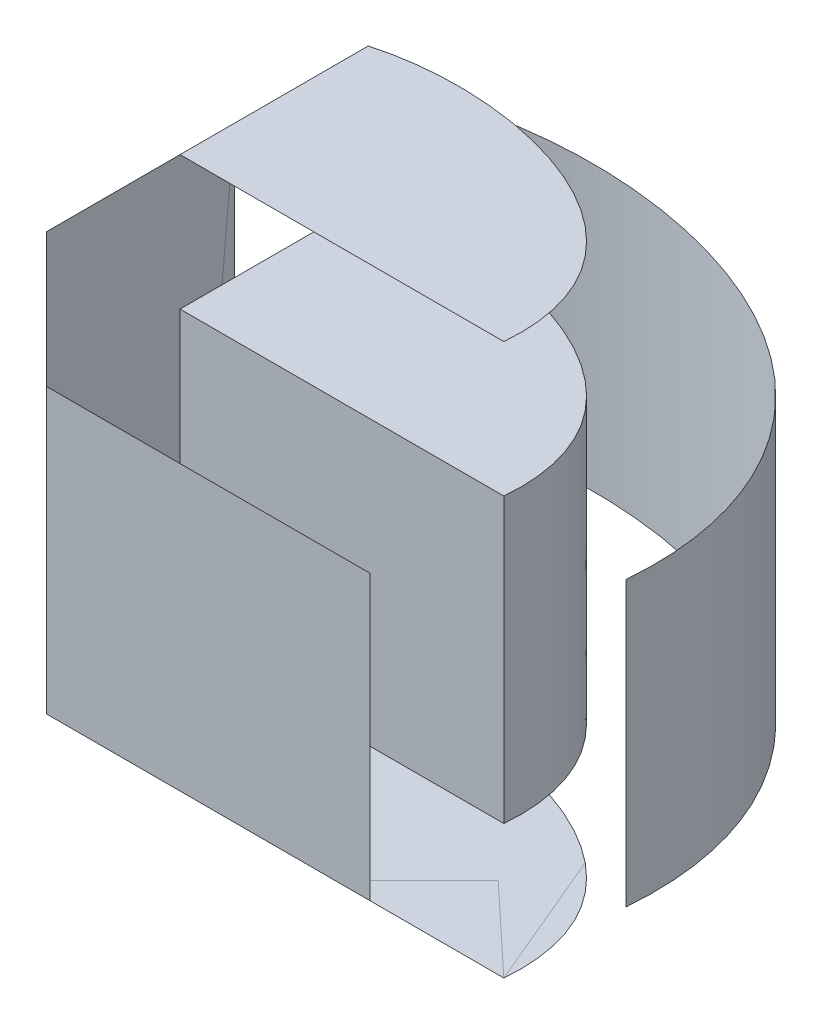
ISO-10303-21;
HEADER;
FILE_DESCRIPTION(('STEP AP214'),'2;1');
FILE_NAME('part.step','',(''),(''),'','','');
FILE_SCHEMA(('AUTOMOTIVE_DESIGN { 1 0 10303 214 1 1 1 1 }'));
ENDSEC;
DATA;
#1=APPLICATION_CONTEXT('core data for automotive mechanical design processes');
#2=APPLICATION_PROTOCOL_DEFINITION('international standard','automotive_design',2000,#1);
#3=PRODUCT_CONTEXT('',#1,'mechanical');
#4=PRODUCT('Part','Part','',(#3));
#5=PRODUCT_RELATED_PRODUCT_CATEGORY('part','',(#4));
#6=PRODUCT_DEFINITION_FORMATION('','',#4);
#7=PRODUCT_DEFINITION_CONTEXT('part definition',#1,'design');
#8=PRODUCT_DEFINITION('design','',#6,#7);
#9=PRODUCT_DEFINITION_SHAPE('','',#8);
#10=(LENGTH_UNIT() NAMED_UNIT(*) SI_UNIT(.MILLI.,.METRE.));
#11=(NAMED_UNIT(*) PLANE_ANGLE_UNIT() SI_UNIT($,.RADIAN.));
#12=(NAMED_UNIT(*) SI_UNIT($,.STERADIAN.) SOLID_ANGLE_UNIT());
#13=UNCERTAINTY_MEASURE_WITH_UNIT(LENGTH_MEASURE(1.E-05),#10,'distance_accuracy_value','');
#14=(GEOMETRIC_REPRESENTATION_CONTEXT(3) GLOBAL_UNCERTAINTY_ASSIGNED_CONTEXT((#13)) GLOBAL_UNIT_ASSIGNED_CONTEXT((#10,
#11,#12)) REPRESENTATION_CONTEXT('',''));
#15=CARTESIAN_POINT('',(0.,0.,0.));
#16=DIRECTION('',(0.,0.,1.));
#17=DIRECTION('',(1.,0.,0.));
#18=AXIS2_PLACEMENT_3D('',#15,#16,#17);
#19=CARTESIAN_POINT('',(18.6420812578485,-103.,-25.6244637121298));
#20=DIRECTION('',(0.,1.,0.));
#21=DIRECTION('',(0.,0.,1.));
#22=AXIS2_PLACEMENT_3D('',#19,#20,#21);
#23=PLANE('',#22);
#24=CARTESIAN_POINT('',(59.7318013736338,-103.,38.4270232031692));
#25=CARTESIAN_POINT('',(65.1709209471579,-103.,-25.3085093729767));
#26=CARTESIAN_POINT('',(-14.935887617342,-103.,-45.201796535286));
#27=CARTESIAN_POINT('',(-61.3002513002938,-103.,-31.8918151754193));
#28=CARTESIAN_POINT('',(-78.2377452730158,-103.,-27.0295090602881));
#29=CARTESIAN_POINT('',(-95.1752392457378,-103.,-22.1672029451569));
#30=CARTESIAN_POINT('',(-112.11273321846,-103.,-17.3048968300257));
#31=B_SPLINE_CURVE_WITH_KNOTS('',3,(#24,#25,#26,#27,#28,#29,#30),.UNSPECIFIED.,.F.,.F.,(4,3,4),
(0.,1.,1.36531276668744),.UNSPECIFIED.);
#32=CARTESIAN_POINT('',(59.7318013736338,-103.,38.4270232031692));
#33=VERTEX_POINT('',#32);
#34=CARTESIAN_POINT('',(-111.300251300294,-103.,-17.5381388790263));
#35=VERTEX_POINT('',#34);
#36=EDGE_CURVE('E75',#33,#35,#31,.T.);
#37=ORIENTED_EDGE('',*,*,#36,.F.);
#38=DIRECTION('',(1.,0.,0.));
#39=VECTOR('',#38,1.);
#40=CARTESIAN_POINT('',(18.6420812578485,-103.,38.4270232031692));
#41=LINE('',#40,#39);
#42=CARTESIAN_POINT('',(-111.300251300294,-103.,38.4270232031692));
#43=VERTEX_POINT('',#42);
#44=EDGE_CURVE('E61',#43,#33,#41,.T.);
#45=ORIENTED_EDGE('',*,*,#44,.F.);
#46=DIRECTION('',(0.,0.,1.));
#47=VECTOR('',#46,1.);
#48=CARTESIAN_POINT('',(-111.300251300294,-103.,38.4270232031692));
#49=LINE('',#48,#47);
#50=EDGE_CURVE('E103',#35,#43,#49,.T.);
#51=ORIENTED_EDGE('',*,*,#50,.F.);
#52=EDGE_LOOP('',(#37,#45,#51));
#53=FACE_BOUND('',#52,.T.);
#54=ADVANCED_FACE('F54',(#53),#23,.F.);
#55=CARTESIAN_POINT('',(-111.300251300294,53.,38.4270232031692));
#56=DIRECTION('',(1.,0.,0.));
#57=DIRECTION('',(0.,0.,-1.));
#58=AXIS2_PLACEMENT_3D('',#55,#56,#57);
#59=PLANE('',#58);
#60=ORIENTED_EDGE('',*,*,#50,.T.);
#61=DIRECTION('',(0.,1.,0.));
#62=VECTOR('',#61,1.);
#63=CARTESIAN_POINT('',(-111.300251300294,53.,38.4270232031692));
#64=LINE('',#63,#62);
#65=CARTESIAN_POINT('',(-111.300251300294,53.,38.4270232031692));
#66=VERTEX_POINT('',#65);
#67=EDGE_CURVE('E89',#66,#43,#64,.F.);
#68=ORIENTED_EDGE('',*,*,#67,.F.);
#69=DIRECTION('',(0.,0.,-1.));
#70=VECTOR('',#69,1.);
#71=CARTESIAN_POINT('',(-111.300251300294,53.,38.4270232031692));
#72=LINE('',#71,#70);
#73=CARTESIAN_POINT('',(-111.300251300294,53.,-31.8918151754193));
#74=VERTEX_POINT('',#73);
#75=EDGE_CURVE('E87',#74,#66,#72,.F.);
#76=ORIENTED_EDGE('',*,*,#75,.F.);
#77=DIRECTION('',(0.,1.,0.));
#78=VECTOR('',#77,1.);
#79=CARTESIAN_POINT('',(-111.300251300294,53.,-31.8918151754193));
#80=LINE('',#79,#78);
#81=CARTESIAN_POINT('',(-111.300251300294,-103.,-31.8918151754193));
#82=VERTEX_POINT('',#81);
#83=EDGE_CURVE('E67',#74,#82,#80,.F.);
#84=ORIENTED_EDGE('',*,*,#83,.T.);
#85=DIRECTION('',(0.,0.,1.));
#86=VECTOR('',#85,1.);
#87=CARTESIAN_POINT('',(-111.300251300294,-103.,38.4270232031692));
#88=LINE('',#87,#86);
#89=EDGE_CURVE('E12',#82,#35,#88,.T.);
#90=ORIENTED_EDGE('',*,*,#89,.T.);
#91=EDGE_LOOP('',(#60,#68,#76,#84,#90));
#92=FACE_BOUND('',#91,.T.);
#93=ADVANCED_FACE('F55',(#92),#59,.F.);
#94=OPEN_SHELL('',(#54,#93));
#95=SHELL_BASED_SURFACE_MODEL('B2',(#94));
#96=CARTESIAN_POINT('',(59.7318013736338,53.,88.4270232031692));
#97=DIRECTION('',(0.,0.,-1.));
#98=DIRECTION('',(-1.,0.,0.));
#99=AXIS2_PLACEMENT_3D('',#96,#97,#98);
#100=PLANE('',#99);
#101=DIRECTION('',(-1.,0.,0.));
#102=VECTOR('',#101,1.);
#103=CARTESIAN_POINT('',(59.7318013736338,-53.,88.4270232031692));
#104=LINE('',#103,#102);
#105=CARTESIAN_POINT('',(-61.3002513002938,-53.,88.4270232031692));
#106=VERTEX_POINT('',#105);
#107=CARTESIAN_POINT('',(59.7318013736338,-53.,88.4270232031692));
#108=VERTEX_POINT('',#107);
#109=EDGE_CURVE('E162',#106,#108,#104,.F.);
#110=ORIENTED_EDGE('',*,*,#109,.T.);
#111=DIRECTION('',(0.,1.,0.));
#112=VECTOR('',#111,1.);
#113=CARTESIAN_POINT('',(59.7318013736338,53.,88.4270232031692));
#114=LINE('',#113,#112);
#115=CARTESIAN_POINT('',(59.7318013736338,53.,88.4270232031692));
#116=VERTEX_POINT('',#115);
#117=EDGE_CURVE('E150',#116,#108,#114,.F.);
#118=ORIENTED_EDGE('',*,*,#117,.F.);
#119=DIRECTION('',(-1.,0.,0.));
#120=VECTOR('',#119,1.);
#121=CARTESIAN_POINT('',(59.7318013736338,53.,88.4270232031692));
#122=LINE('',#121,#120);
#123=CARTESIAN_POINT('',(-61.3002513002938,53.,88.4270232031692));
#124=VERTEX_POINT('',#123);
#125=EDGE_CURVE('E156',#124,#116,#122,.F.);
#126=ORIENTED_EDGE('',*,*,#125,.F.);
#127=DIRECTION('',(0.,1.,0.));
#128=VECTOR('',#127,1.);
#129=CARTESIAN_POINT('',(-61.3002513002938,53.,88.4270232031692));
#130=LINE('',#129,#128);
#131=EDGE_CURVE('E52',#124,#106,#130,.F.);
#132=ORIENTED_EDGE('',*,*,#131,.T.);
#133=EDGE_LOOP('',(#110,#118,#126,#132));
#134=FACE_BOUND('',#133,.T.);
#135=ADVANCED_FACE('F149',(#134),#100,.F.);
#136=OPEN_SHELL('',(#135));
#137=SHELL_BASED_SURFACE_MODEL('B6',(#136));
#138=CARTESIAN_POINT('',(-111.300251300294,53.,38.4270232031692));
#139=DIRECTION('',(1.,0.,0.));
#140=DIRECTION('',(0.,0.,-1.));
#141=AXIS2_PLACEMENT_3D('',#138,#139,#140);
#142=PLANE('',#141);
#143=DIRECTION('',(0.,0.,-1.));
#144=VECTOR('',#143,1.);
#145=CARTESIAN_POINT('',(-111.300251300294,-53.,38.4270232031692));
#146=LINE('',#145,#144);
#147=CARTESIAN_POINT('',(-111.300251300294,-53.,-31.8918151754193));
#148=VERTEX_POINT('',#147);
#149=CARTESIAN_POINT('',(-111.300251300294,-53.,38.4270232031692));
#150=VERTEX_POINT('',#149);
#151=EDGE_CURVE('E217',#148,#150,#146,.F.);
#152=ORIENTED_EDGE('',*,*,#151,.T.);
#153=DIRECTION('',(0.,1.,0.));
#154=VECTOR('',#153,1.);
#155=CARTESIAN_POINT('',(-111.300251300294,53.,38.4270232031692));
#156=LINE('',#155,#154);
#157=CARTESIAN_POINT('',(-111.300251300294,53.,38.4270232031692));
#158=VERTEX_POINT('',#157);
#159=EDGE_CURVE('E205',#158,#150,#156,.F.);
#160=ORIENTED_EDGE('',*,*,#159,.F.);
#161=DIRECTION('',(0.,0.,-1.));
#162=VECTOR('',#161,1.);
#163=CARTESIAN_POINT('',(-111.300251300294,53.,38.4270232031692));
#164=LINE('',#163,#162);
#165=CARTESIAN_POINT('',(-111.300251300294,53.,-31.8918151754193));
#166=VERTEX_POINT('',#165);
#167=EDGE_CURVE('E211',#166,#158,#164,.F.);
#168=ORIENTED_EDGE('',*,*,#167,.F.);
#169=DIRECTION('',(0.,1.,0.));
#170=VECTOR('',#169,1.);
#171=CARTESIAN_POINT('',(-111.300251300294,53.,-31.8918151754193));
#172=LINE('',#171,#170);
#173=EDGE_CURVE('E147',#166,#148,#172,.F.);
#174=ORIENTED_EDGE('',*,*,#173,.T.);
#175=EDGE_LOOP('',(#152,#160,#168,#174));
#176=FACE_BOUND('',#175,.T.);
#177=ADVANCED_FACE('F204',(#176),#142,.F.);
#178=OPEN_SHELL('',(#177));
#179=SHELL_BASED_SURFACE_MODEL('B46',(#178));
#180=CARTESIAN_POINT('',(18.6420812578485,-103.,-25.6244637121298));
#181=DIRECTION('',(0.,1.,0.));
#182=DIRECTION('',(0.,0.,1.));
#183=AXIS2_PLACEMENT_3D('',#180,#181,#182);
#184=PLANE('',#183);
#185=CARTESIAN_POINT('',(59.7318013736338,-103.,38.4270232031692));
#186=CARTESIAN_POINT('',(65.1709209471579,-103.,-25.3085093729767));
#187=CARTESIAN_POINT('',(-14.935887617342,-103.,-45.201796535286));
#188=CARTESIAN_POINT('',(-61.3002513002938,-103.,-31.8918151754193));
#189=B_SPLINE_CURVE_WITH_KNOTS('',3,(#185,#186,#187,#188),.UNSPECIFIED.,.F.,.F.,(4,4),(0.,1.),.UNSPECIFIED.);
#190=CARTESIAN_POINT('',(59.7318013736338,-103.,38.4270232031692));
#191=VERTEX_POINT('',#190);
#192=CARTESIAN_POINT('',(-61.3002513002938,-103.,-31.8918151754193));
#193=VERTEX_POINT('',#192);
#194=EDGE_CURVE('E270',#191,#193,#189,.T.);
#195=ORIENTED_EDGE('',*,*,#194,.F.);
#196=DIRECTION('',(1.,0.,0.));
#197=VECTOR('',#196,1.);
#198=CARTESIAN_POINT('',(18.6420812578485,-103.,38.4270232031692));
#199=LINE('',#198,#197);
#200=CARTESIAN_POINT('',(-61.3002513002938,-103.,38.4270232031692));
#201=VERTEX_POINT('',#200);
#202=EDGE_CURVE('E260',#201,#191,#199,.T.);
#203=ORIENTED_EDGE('',*,*,#202,.F.);
#204=DIRECTION('',(0.,0.,1.));
#205=VECTOR('',#204,1.);
#206=CARTESIAN_POINT('',(-61.3002513002938,-103.,-25.6244637121298));
#207=LINE('',#206,#205);
#208=EDGE_CURVE('E202',#193,#201,#207,.T.);
#209=ORIENTED_EDGE('',*,*,#208,.F.);
#210=EDGE_LOOP('',(#195,#203,#209));
#211=FACE_BOUND('',#210,.T.);
#212=ADVANCED_FACE('F259',(#211),#184,.F.);
#213=OPEN_SHELL('',(#212));
#214=SHELL_BASED_SURFACE_MODEL('B141',(#213));
#215=CARTESIAN_POINT('',(18.6420812578485,103.,-25.6244637121298));
#216=DIRECTION('',(0.,1.,0.));
#217=DIRECTION('',(0.,0.,1.));
#218=AXIS2_PLACEMENT_3D('',#215,#216,#217);
#219=PLANE('',#218);
#220=CARTESIAN_POINT('',(59.7318013736338,103.,38.4270232031692));
#221=CARTESIAN_POINT('',(65.1709209471579,103.,-25.3085093729767));
#222=CARTESIAN_POINT('',(-14.935887617342,103.,-45.201796535286));
#223=CARTESIAN_POINT('',(-61.3002513002938,103.,-31.8918151754193));
#224=B_SPLINE_CURVE_WITH_KNOTS('',3,(#220,#221,#222,#223),.UNSPECIFIED.,.F.,.F.,(4,4),(0.,1.),.UNSPECIFIED.);
#225=CARTESIAN_POINT('',(59.7318013736338,103.,38.4270232031692));
#226=VERTEX_POINT('',#225);
#227=CARTESIAN_POINT('',(-61.3002513002938,103.,-31.8918151754193));
#228=VERTEX_POINT('',#227);
#229=EDGE_CURVE('E322',#226,#228,#224,.T.);
#230=ORIENTED_EDGE('',*,*,#229,.T.);
#231=DIRECTION('',(0.,0.,1.));
#232=VECTOR('',#231,1.);
#233=CARTESIAN_POINT('',(-61.3002513002938,103.,-25.6244637121298));
#234=LINE('',#233,#232);
#235=CARTESIAN_POINT('',(-61.3002513002938,103.,38.4270232031692));
#236=VERTEX_POINT('',#235);
#237=EDGE_CURVE('E312',#228,#236,#234,.T.);
#238=ORIENTED_EDGE('',*,*,#237,.T.);
#239=DIRECTION('',(1.,0.,0.));
#240=VECTOR('',#239,1.);
#241=CARTESIAN_POINT('',(18.6420812578485,103.,38.4270232031692));
#242=LINE('',#241,#240);
#243=EDGE_CURVE('E257',#236,#226,#242,.T.);
#244=ORIENTED_EDGE('',*,*,#243,.T.);
#245=EDGE_LOOP('',(#230,#238,#244));
#246=FACE_BOUND('',#245,.T.);
#247=ADVANCED_FACE('F311',(#246),#219,.T.);
#248=OPEN_SHELL('',(#247));
#249=SHELL_BASED_SURFACE_MODEL('B196',(#248));
#250=CARTESIAN_POINT('',(59.7318013736338,53.,38.4270232031692));
#251=CARTESIAN_POINT('',(65.1709209471579,53.,-25.3085093729767));
#252=CARTESIAN_POINT('',(-14.935887617342,53.,-45.201796535286));
#253=CARTESIAN_POINT('',(-61.3002513002938,53.,-31.8918151754193));
#254=B_SPLINE_CURVE_WITH_KNOTS('',3,(#250,#251,#252,#253),.UNSPECIFIED.,.F.,.F.,(4,4),(0.,1.),.UNSPECIFIED.);
#255=DIRECTION('',(0.,-1.,0.));
#256=VECTOR('',#255,1.);
#257=SURFACE_OF_LINEAR_EXTRUSION('',#254,#256);
#258=OFFSET_SURFACE('',#257,-50.,.F.);
#259=CARTESIAN_POINT('',(109.550721689106,-53.,42.6785145415816));
#260=CARTESIAN_POINT('',(109.691897002044,-53.,41.0247513833811));
#261=CARTESIAN_POINT('',(109.800131911101,-53.,39.3680926615421));
#262=CARTESIAN_POINT('',(109.948442166677,-53.,36.0580682957251));
#263=CARTESIAN_POINT('',(109.988775753422,-53.,34.4047141704552));
#264=CARTESIAN_POINT('',(110.000089546775,-53.,31.1037699735177));
#265=CARTESIAN_POINT('',(109.97132241141,-53.,29.4561808949364));
#266=CARTESIAN_POINT('',(109.843567089681,-53.,26.1697192805434));
#267=CARTESIAN_POINT('',(109.74483508213,-53.,24.5308368554087));
#268=CARTESIAN_POINT('',(109.476606858063,-53.,21.2650973701207));
#269=CARTESIAN_POINT('',(109.307379895022,-53.,19.6382182729406));
#270=CARTESIAN_POINT('',(108.898034055841,-53.,16.4001116229476));
#271=CARTESIAN_POINT('',(108.658206433402,-53.,14.788847320094));
#272=CARTESIAN_POINT('',(108.107999493781,-53.,11.5858271743942));
#273=CARTESIAN_POINT('',(107.797941088425,-53.,9.99401627049719));
#274=CARTESIAN_POINT('',(107.108123178737,-53.,6.83389570331818));
#275=CARTESIAN_POINT('',(106.728719934161,-53.,5.26550832881409));
#276=CARTESIAN_POINT('',(105.901592838579,-53.,2.15625576770465));
#277=CARTESIAN_POINT('',(105.454263800082,-53.,0.615285597737529));
#278=CARTESIAN_POINT('',(104.493192067031,-53.,-2.4351950225622));
#279=CARTESIAN_POINT('',(103.979883155148,-53.,-3.94484210879258));
#280=CARTESIAN_POINT('',(102.889257615029,-53.,-6.9289316278811));
#281=CARTESIAN_POINT('',(102.312411334116,-53.,-8.40354595303546));
#282=CARTESIAN_POINT('',(101.097566326282,-53.,-11.3141172959595));
#283=CARTESIAN_POINT('',(100.460069518084,-53.,-12.7502838231043));
#284=CARTESIAN_POINT('',(99.1271597403327,-53.,-15.5808834396926));
#285=CARTESIAN_POINT('',(98.4322731494088,-53.,-16.9755644371504));
#286=CARTESIAN_POINT('',(96.9881191918915,-53.,-19.7205577021152));
#287=CARTESIAN_POINT('',(96.2393940706839,-53.,-21.0711553161002));
#288=CARTESIAN_POINT('',(94.6913079019139,-53.,-23.725829209463));
#289=CARTESIAN_POINT('',(93.892495608409,-53.,-25.0302255952038));
#290=CARTESIAN_POINT('',(92.2480980672027,-53.,-27.5908459730227));
#291=CARTESIAN_POINT('',(91.403058668415,-53.,-28.8474206280654));
#292=CARTESIAN_POINT('',(89.6701004742637,-53.,-31.3112452492015));
#293=CARTESIAN_POINT('',(88.7827157784082,-53.,-32.5188710315052));
#294=CARTESIAN_POINT('',(86.9689119142056,-53.,-34.8841227710999));
#295=CARTESIAN_POINT('',(86.0430073101919,-53.,-36.0421434978731));
#296=CARTESIAN_POINT('',(84.1558922353936,-53.,-38.3079505268622));
#297=CARTESIAN_POINT('',(83.1951703924241,-53.,-39.4161439821534));
#298=CARTESIAN_POINT('',(81.2419788307791,-53.,-41.5824549991864));
#299=CARTESIAN_POINT('',(80.249966948895,-53.,-42.6409855605039));
#300=CARTESIAN_POINT('',(78.237542337607,-53.,-44.708468478503));
#301=CARTESIAN_POINT('',(77.2175533639189,-53.,-45.7178335184431));
#302=CARTESIAN_POINT('',(75.1522837903916,-53.,-47.6877654974045));
#303=CARTESIAN_POINT('',(74.107391042299,-53.,-48.64873927512));
#304=CARTESIAN_POINT('',(71.9951705503887,-53.,-50.5228950142462));
#305=CARTESIAN_POINT('',(70.9281942244966,-53.,-51.436473247096));
#306=CARTESIAN_POINT('',(68.774406778975,-53.,-53.2170167571519));
#307=CARTESIAN_POINT('',(67.6879111810781,-53.,-54.0843639118125));
#308=CARTESIAN_POINT('',(65.4974317069267,-53.,-55.7737486676506));
#309=CARTESIAN_POINT('',(64.3937288451007,-53.,-56.5961508275789));
#310=CARTESIAN_POINT('',(62.1709437473732,-53.,-58.1970275674483));
#311=CARTESIAN_POINT('',(61.0521099620301,-53.,-58.9758473593922));
#312=CARTESIAN_POINT('',(58.8009295974961,-53.,-60.4909931882662));
#313=CARTESIAN_POINT('',(57.668801437129,-53.,-61.2276437548596));
#314=CARTESIAN_POINT('',(55.392748114071,-53.,-62.6598678084439));
#315=CARTESIAN_POINT('',(54.2490134337535,-53.,-63.3557448367026));
#316=CARTESIAN_POINT('',(50.8161818590977,-53.,-65.3757374486384));
#317=CARTESIAN_POINT('',(48.4979116897137,-53.,-66.6506713286384));
#318=CARTESIAN_POINT('',(43.8295879299046,-53.,-69.0518117565101));
#319=CARTESIAN_POINT('',(41.4805240205892,-53.,-70.1799528615453));
#320=CARTESIAN_POINT('',(36.7583776079621,-53.,-72.2978655265652));
#321=CARTESIAN_POINT('',(34.3860300564686,-53.,-73.2892778178156));
#322=CARTESIAN_POINT('',(29.6237406934047,-53.,-75.1427842241357));
#323=CARTESIAN_POINT('',(27.2343389031817,-53.,-76.0062692449743));
#324=CARTESIAN_POINT('',(22.4431415863656,-53.,-77.6118026306108));
#325=CARTESIAN_POINT('',(20.0417419225702,-53.,-78.3550346669328));
#326=CARTESIAN_POINT('',(15.2309390691597,-53.,-79.7267422306414));
#327=CARTESIAN_POINT('',(12.8218251439553,-53.,-80.356234286734));
#328=CARTESIAN_POINT('',(7.99938693686739,-53.,-81.5060189677944));
#329=CARTESIAN_POINT('',(5.5862729810916,-53.,-82.0271953523806));
#330=CARTESIAN_POINT('',(0.759193032758932,-53.,-82.9648566813198));
#331=CARTESIAN_POINT('',(-1.65462193357464,-53.,-83.3821203800638));
#332=CARTESIAN_POINT('',(-6.48008859318881,-53.,-84.1154876583996));
#333=CARTESIAN_POINT('',(-8.89163487898916,-53.,-84.4322857247382));
#334=CARTESIAN_POINT('',(-13.7098473081202,-53.,-84.967328674434));
#335=CARTESIAN_POINT('',(-16.116444234525,-53.,-85.1861973680324));
#336=CARTESIAN_POINT('',(-20.9223333709398,-53.,-85.5270889546148));
#337=CARTESIAN_POINT('',(-23.3215858904796,-53.,-85.6496711913992));
#338=CARTESIAN_POINT('',(-28.1106760591083,-53.,-85.7987871983481));
#339=CARTESIAN_POINT('',(-30.5004982838314,-53.,-85.825814076993));
#340=CARTESIAN_POINT('',(-35.2689756556858,-53.,-85.7836539213512));
#341=CARTESIAN_POINT('',(-37.6476343676319,-53.,-85.7148828061307));
#342=CARTESIAN_POINT('',(-42.3924436443369,-53.,-85.4798927323174));
#343=CARTESIAN_POINT('',(-44.7586097627145,-53.,-85.3139903132117));
#344=CARTESIAN_POINT('',(-49.4775699046189,-53.,-84.8822714825758));
#345=CARTESIAN_POINT('',(-51.8303803384962,-53.,-84.6166355979378));
#346=CARTESIAN_POINT('',(-56.5222566216715,-53.,-83.9814911763813));
#347=CARTESIAN_POINT('',(-58.8613209639434,-53.,-83.6119714595136));
#348=CARTESIAN_POINT('',(-63.5259456453691,-53.,-82.763322598675));
#349=CARTESIAN_POINT('',(-65.8514547023267,-53.,-82.2839094609451));
#350=CARTESIAN_POINT('',(-70.4893241054945,-53.,-81.2072969711606));
#351=CARTESIAN_POINT('',(-72.8015280122205,-53.,-80.6094251577371));
#352=CARTESIAN_POINT('',(-75.0966903679608,-53.,-79.950719335337));
#353=B_SPLINE_CURVE_WITH_KNOTS('',3,(#259,#260,#261,#262,#263,#264,#265,#266,#267,#268,#269,
#270,#271,#272,#273,#274,#275,#276,#277,#278,#279,#280,#281,#282,#283,#284,#285,#286,#287,#288,
#289,#290,#291,#292,#293,#294,#295,#296,#297,#298,#299,#300,#301,#302,#303,#304,#305,#306,#307,
#308,#309,#310,#311,#312,#313,#314,#315,#316,#317,#318,#319,#320,#321,#322,#323,#324,#325,#326,
#327,#328,#329,#330,#331,#332,#333,#334,#335,#336,#337,#338,#339,#340,#341,#342,#343,#344,#345,
#346,#347,#348,#349,#350,#351,#352),.UNSPECIFIED.,.F.,.F.,(4,2,2,2,2,2,2,2,2,2,2,2,2,2,2,2,2,2,
2,2,2,2,2,2,2,2,2,2,2,2,2,2,2,2,2,2,2,2,2,2,2,2,2,2,2,2,4),(0.,4.97912808817953,
9.93927657028292,14.8813165217221,19.8053539027368,24.7107540441837,29.5961946109981,
34.4597466033989,39.2989806487874,44.1110937101391,48.893049305059,53.6417232879981,
58.3540465705702,63.0271367038041,67.6584114022374,72.2456789724811,76.7872027133498,
81.2817386086904,85.7285475735079,90.1273851295887,94.4784724041644,98.7824528809675,
103.040339414746,107.253455696033,111.423375828988,115.551864958749,119.640823252951,
123.692234756696,127.708122113752,135.64058057168,143.454733057534,151.164959248186,
158.783986659873,166.322734976501,173.790357973019,181.194426922785,188.541214043399,
195.836048459187,203.083729116771,210.288988849825,217.457011499634,224.594010088019,
231.7078784915,238.808931727129,245.910749468874,253.031131338661,260.193155936517),.UNSPECIFIED.);
#354=CARTESIAN_POINT('',(109.550721689208,-53.,42.6785145403845));
#355=VERTEX_POINT('',#354);
#356=CARTESIAN_POINT('',(-75.0966903695773,-53.,-79.9507193348729));
#357=VERTEX_POINT('',#356);
#358=EDGE_CURVE('E377',#355,#357,#353,.T.);
#359=ORIENTED_EDGE('',*,*,#358,.T.);
#360=DIRECTION('',(0.,-1.,0.));
#361=VECTOR('',#360,1.);
#362=CARTESIAN_POINT('',(-75.0966903695773,53.,-79.9507193348729));
#363=LINE('',#362,#361);
#364=CARTESIAN_POINT('',(-75.0966903695773,53.,-79.9507193348729));
#365=VERTEX_POINT('',#364);
#366=EDGE_CURVE('E365',#365,#357,#363,.T.);
#367=ORIENTED_EDGE('',*,*,#366,.F.);
#368=CARTESIAN_POINT('',(109.550721689106,53.,42.6785145415816));
#369=CARTESIAN_POINT('',(109.691897002044,53.,41.0247513833811));
#370=CARTESIAN_POINT('',(109.800131911101,53.,39.3680926615421));
#371=CARTESIAN_POINT('',(109.948442166677,53.,36.0580682957251));
#372=CARTESIAN_POINT('',(109.988775753422,53.,34.4047141704552));
#373=CARTESIAN_POINT('',(110.000089546775,53.,31.1037699735177));
#374=CARTESIAN_POINT('',(109.97132241141,53.,29.4561808949364));
#375=CARTESIAN_POINT('',(109.843567089681,53.,26.1697192805434));
#376=CARTESIAN_POINT('',(109.74483508213,53.,24.5308368554087));
#377=CARTESIAN_POINT('',(109.476606858063,53.,21.2650973701207));
#378=CARTESIAN_POINT('',(109.307379895022,53.,19.6382182729406));
#379=CARTESIAN_POINT('',(108.898034055841,53.,16.4001116229476));
#380=CARTESIAN_POINT('',(108.658206433402,53.,14.788847320094));
#381=CARTESIAN_POINT('',(108.107999493781,53.,11.5858271743942));
#382=CARTESIAN_POINT('',(107.797941088425,53.,9.99401627049719));
#383=CARTESIAN_POINT('',(107.108123178737,53.,6.83389570331818));
#384=CARTESIAN_POINT('',(106.728719934161,53.,5.26550832881409));
#385=CARTESIAN_POINT('',(105.901592838579,53.,2.15625576770465));
#386=CARTESIAN_POINT('',(105.454263800082,53.,0.615285597737529));
#387=CARTESIAN_POINT('',(104.493192067031,53.,-2.4351950225622));
#388=CARTESIAN_POINT('',(103.979883155148,53.,-3.94484210879258));
#389=CARTESIAN_POINT('',(102.889257615029,53.,-6.9289316278811));
#390=CARTESIAN_POINT('',(102.312411334116,53.,-8.40354595303546));
#391=CARTESIAN_POINT('',(101.097566326282,53.,-11.3141172959595));
#392=CARTESIAN_POINT('',(100.460069518084,53.,-12.7502838231043));
#393=CARTESIAN_POINT('',(99.1271597403327,53.,-15.5808834396926));
#394=CARTESIAN_POINT('',(98.4322731494088,53.,-16.9755644371504));
#395=CARTESIAN_POINT('',(96.9881191918915,53.,-19.7205577021152));
#396=CARTESIAN_POINT('',(96.2393940706839,53.,-21.0711553161002));
#397=CARTESIAN_POINT('',(94.6913079019139,53.,-23.725829209463));
#398=CARTESIAN_POINT('',(93.892495608409,53.,-25.0302255952038));
#399=CARTESIAN_POINT('',(92.2480980672027,53.,-27.5908459730227));
#400=CARTESIAN_POINT('',(91.403058668415,53.,-28.8474206280654));
#401=CARTESIAN_POINT('',(89.6701004742637,53.,-31.3112452492015));
#402=CARTESIAN_POINT('',(88.7827157784082,53.,-32.5188710315052));
#403=CARTESIAN_POINT('',(86.9689119142056,53.,-34.8841227710999));
#404=CARTESIAN_POINT('',(86.0430073101919,53.,-36.0421434978731));
#405=CARTESIAN_POINT('',(84.1558922353936,53.,-38.3079505268622));
#406=CARTESIAN_POINT('',(83.1951703924241,53.,-39.4161439821534));
#407=CARTESIAN_POINT('',(81.2419788307791,53.,-41.5824549991864));
#408=CARTESIAN_POINT('',(80.249966948895,53.,-42.6409855605039));
#409=CARTESIAN_POINT('',(78.237542337607,53.,-44.708468478503));
#410=CARTESIAN_POINT('',(77.2175533639189,53.,-45.7178335184431));
#411=CARTESIAN_POINT('',(75.1522837903916,53.,-47.6877654974045));
#412=CARTESIAN_POINT('',(74.107391042299,53.,-48.64873927512));
#413=CARTESIAN_POINT('',(71.9951705503887,53.,-50.5228950142462));
#414=CARTESIAN_POINT('',(70.9281942244966,53.,-51.436473247096));
#415=CARTESIAN_POINT('',(68.774406778975,53.,-53.2170167571519));
#416=CARTESIAN_POINT('',(67.6879111810781,53.,-54.0843639118125));
#417=CARTESIAN_POINT('',(65.4974317069267,53.,-55.7737486676506));
#418=CARTESIAN_POINT('',(64.3937288451007,53.,-56.5961508275789));
#419=CARTESIAN_POINT('',(62.1709437473732,53.,-58.1970275674483));
#420=CARTESIAN_POINT('',(61.0521099620301,53.,-58.9758473593922));
#421=CARTESIAN_POINT('',(58.8009295974961,53.,-60.4909931882662));
#422=CARTESIAN_POINT('',(57.668801437129,53.,-61.2276437548596));
#423=CARTESIAN_POINT('',(55.392748114071,53.,-62.6598678084439));
#424=CARTESIAN_POINT('',(54.2490134337535,53.,-63.3557448367026));
#425=CARTESIAN_POINT('',(50.8161818590977,53.,-65.3757374486384));
#426=CARTESIAN_POINT('',(48.4979116897137,53.,-66.6506713286384));
#427=CARTESIAN_POINT('',(43.8295879299046,53.,-69.0518117565101));
#428=CARTESIAN_POINT('',(41.4805240205892,53.,-70.1799528615453));
#429=CARTESIAN_POINT('',(36.7583776079621,53.,-72.2978655265652));
#430=CARTESIAN_POINT('',(34.3860300564686,53.,-73.2892778178156));
#431=CARTESIAN_POINT('',(29.6237406934047,53.,-75.1427842241357));
#432=CARTESIAN_POINT('',(27.2343389031817,53.,-76.0062692449743));
#433=CARTESIAN_POINT('',(22.4431415863656,53.,-77.6118026306108));
#434=CARTESIAN_POINT('',(20.0417419225702,53.,-78.3550346669328));
#435=CARTESIAN_POINT('',(15.2309390691597,53.,-79.7267422306414));
#436=CARTESIAN_POINT('',(12.8218251439553,53.,-80.356234286734));
#437=CARTESIAN_POINT('',(7.99938693686739,53.,-81.5060189677944));
#438=CARTESIAN_POINT('',(5.5862729810916,53.,-82.0271953523806));
#439=CARTESIAN_POINT('',(0.759193032758932,53.,-82.9648566813198));
#440=CARTESIAN_POINT('',(-1.65462193357464,53.,-83.3821203800638));
#441=CARTESIAN_POINT('',(-6.48008859318881,53.,-84.1154876583996));
#442=CARTESIAN_POINT('',(-8.89163487898916,53.,-84.4322857247382));
#443=CARTESIAN_POINT('',(-13.7098473081202,53.,-84.967328674434));
#444=CARTESIAN_POINT('',(-16.116444234525,53.,-85.1861973680324));
#445=CARTESIAN_POINT('',(-20.9223333709398,53.,-85.5270889546148));
#446=CARTESIAN_POINT('',(-23.3215858904796,53.,-85.6496711913992));
#447=CARTESIAN_POINT('',(-28.1106760591083,53.,-85.7987871983481));
#448=CARTESIAN_POINT('',(-30.5004982838314,53.,-85.825814076993));
#449=CARTESIAN_POINT('',(-35.2689756556858,53.,-85.7836539213512));
#450=CARTESIAN_POINT('',(-37.6476343676319,53.,-85.7148828061307));
#451=CARTESIAN_POINT('',(-42.3924436443369,53.,-85.4798927323174));
#452=CARTESIAN_POINT('',(-44.7586097627145,53.,-85.3139903132117));
#453=CARTESIAN_POINT('',(-49.4775699046189,53.,-84.8822714825758));
#454=CARTESIAN_POINT('',(-51.8303803384962,53.,-84.6166355979378));
#455=CARTESIAN_POINT('',(-56.5222566216715,53.,-83.9814911763813));
#456=CARTESIAN_POINT('',(-58.8613209639434,53.,-83.6119714595136));
#457=CARTESIAN_POINT('',(-63.5259456453691,53.,-82.763322598675));
#458=CARTESIAN_POINT('',(-65.8514547023267,53.,-82.2839094609451));
#459=CARTESIAN_POINT('',(-70.4893241054945,53.,-81.2072969711606));
#460=CARTESIAN_POINT('',(-72.8015280122205,53.,-80.6094251577371));
#461=CARTESIAN_POINT('',(-75.0966903679608,53.,-79.950719335337));
#462=B_SPLINE_CURVE_WITH_KNOTS('',3,(#368,#369,#370,#371,#372,#373,#374,#375,#376,#377,#378,
#379,#380,#381,#382,#383,#384,#385,#386,#387,#388,#389,#390,#391,#392,#393,#394,#395,#396,#397,
#398,#399,#400,#401,#402,#403,#404,#405,#406,#407,#408,#409,#410,#411,#412,#413,#414,#415,#416,
#417,#418,#419,#420,#421,#422,#423,#424,#425,#426,#427,#428,#429,#430,#431,#432,#433,#434,#435,
#436,#437,#438,#439,#440,#441,#442,#443,#444,#445,#446,#447,#448,#449,#450,#451,#452,#453,#454,
#455,#456,#457,#458,#459,#460,#461),.UNSPECIFIED.,.F.,.F.,(4,2,2,2,2,2,2,2,2,2,2,2,2,2,2,2,2,2,
2,2,2,2,2,2,2,2,2,2,2,2,2,2,2,2,2,2,2,2,2,2,2,2,2,2,2,2,4),(0.,4.97912808817953,
9.93927657028292,14.8813165217221,19.8053539027368,24.7107540441837,29.5961946109981,
34.4597466033989,39.2989806487874,44.1110937101391,48.893049305059,53.6417232879981,
58.3540465705702,63.0271367038041,67.6584114022374,72.2456789724811,76.7872027133498,
81.2817386086904,85.7285475735079,90.1273851295887,94.4784724041644,98.7824528809675,
103.040339414746,107.253455696033,111.423375828988,115.551864958749,119.640823252951,
123.692234756696,127.708122113752,135.64058057168,143.454733057534,151.164959248186,
158.783986659873,166.322734976501,173.790357973019,181.194426922785,188.541214043399,
195.836048459187,203.083729116771,210.288988849825,217.457011499634,224.594010088019,
231.7078784915,238.808931727129,245.910749468874,253.031131338661,260.193155936517),.UNSPECIFIED.);
#463=CARTESIAN_POINT('',(109.550721689208,53.,42.6785145403845));
#464=VERTEX_POINT('',#463);
#465=EDGE_CURVE('E371',#464,#365,#462,.T.);
#466=ORIENTED_EDGE('',*,*,#465,.F.);
#467=DIRECTION('',(0.,-1.,0.));
#468=VECTOR('',#467,1.);
#469=CARTESIAN_POINT('',(109.550721689208,53.,42.6785145403845));
#470=LINE('',#469,#468);
#471=EDGE_CURVE('E309',#464,#355,#470,.T.);
#472=ORIENTED_EDGE('',*,*,#471,.T.);
#473=EDGE_LOOP('',(#359,#367,#466,#472));
#474=FACE_BOUND('',#473,.T.);
#475=ADVANCED_FACE('F362',(#474),#258,.F.);
#476=OPEN_SHELL('',(#475));
#477=SHELL_BASED_SURFACE_MODEL('B251',(#476));
#478=CARTESIAN_POINT('',(59.7318013736338,53.,38.4270232031692));
#479=CARTESIAN_POINT('',(65.1709209471579,53.,-25.3085093729767));
#480=CARTESIAN_POINT('',(-14.935887617342,53.,-45.201796535286));
#481=CARTESIAN_POINT('',(-61.3002513002938,53.,-31.8918151754193));
#482=B_SPLINE_CURVE_WITH_KNOTS('',3,(#478,#479,#480,#481),.UNSPECIFIED.,.F.,.F.,(4,4),(0.,1.),.UNSPECIFIED.);
#483=DIRECTION('',(0.,-1.,0.));
#484=VECTOR('',#483,1.);
#485=SURFACE_OF_LINEAR_EXTRUSION('',#482,#484);
#486=CARTESIAN_POINT('',(59.7318013736338,-53.,38.4270232031692));
#487=CARTESIAN_POINT('',(65.1709209471579,-53.,-25.3085093729767));
#488=CARTESIAN_POINT('',(-14.935887617342,-53.,-45.201796535286));
#489=CARTESIAN_POINT('',(-61.3002513002938,-53.,-31.8918151754193));
#490=B_SPLINE_CURVE_WITH_KNOTS('',3,(#486,#487,#488,#489),.UNSPECIFIED.,.F.,.F.,(4,4),(0.,1.),.UNSPECIFIED.);
#491=CARTESIAN_POINT('',(59.7318013736338,-53.,38.4270232031692));
#492=VERTEX_POINT('',#491);
#493=CARTESIAN_POINT('',(-61.3002513002938,-53.,-31.8918151754193));
#494=VERTEX_POINT('',#493);
#495=EDGE_CURVE('E477',#492,#494,#490,.T.);
#496=ORIENTED_EDGE('',*,*,#495,.T.);
#497=DIRECTION('',(0.,-1.,0.));
#498=VECTOR('',#497,1.);
#499=CARTESIAN_POINT('',(-61.3002513002938,53.,-31.8918151754193));
#500=LINE('',#499,#498);
#501=CARTESIAN_POINT('',(-61.3002513002938,53.,-31.8918151754193));
#502=VERTEX_POINT('',#501);
#503=EDGE_CURVE('E360',#502,#494,#500,.T.);
#504=ORIENTED_EDGE('',*,*,#503,.F.);
#505=CARTESIAN_POINT('',(59.7318013736338,53.,38.4270232031692));
#506=VERTEX_POINT('',#505);
#507=EDGE_CURVE('E471',#506,#502,#482,.T.);
#508=ORIENTED_EDGE('',*,*,#507,.F.);
#509=DIRECTION('',(0.,-1.,0.));
#510=VECTOR('',#509,1.);
#511=CARTESIAN_POINT('',(59.7318013736338,53.,38.4270232031692));
#512=LINE('',#511,#510);
#513=EDGE_CURVE('E478',#506,#492,#512,.T.);
#514=ORIENTED_EDGE('',*,*,#513,.T.);
#515=EDGE_LOOP('',(#496,#504,#508,#514));
#516=FACE_BOUND('',#515,.T.);
#517=ADVANCED_FACE('F430',(#516),#485,.F.);
#518=CARTESIAN_POINT('',(-61.3002513002938,53.,38.4270232031692));
#519=DIRECTION('',(1.,0.,0.));
#520=DIRECTION('',(0.,0.,-1.));
#521=AXIS2_PLACEMENT_3D('',#518,#519,#520);
#522=PLANE('',#521);
#523=DIRECTION('',(0.,0.,1.));
#524=VECTOR('',#523,1.);
#525=CARTESIAN_POINT('',(-61.3002513002938,-53.,38.4270232031692));
#526=LINE('',#525,#524);
#527=CARTESIAN_POINT('',(-61.3002513002938,-53.,38.4270232031692));
#528=VERTEX_POINT('',#527);
#529=EDGE_CURVE('E459',#494,#528,#526,.T.);
#530=ORIENTED_EDGE('',*,*,#529,.T.);
#531=DIRECTION('',(0.,-1.,0.));
#532=VECTOR('',#531,1.);
#533=CARTESIAN_POINT('',(-61.3002513002938,53.,38.4270232031692));
#534=LINE('',#533,#532);
#535=CARTESIAN_POINT('',(-61.3002513002938,53.,38.4270232031692));
#536=VERTEX_POINT('',#535);
#537=EDGE_CURVE('E439',#536,#528,#534,.T.);
#538=ORIENTED_EDGE('',*,*,#537,.F.);
#539=DIRECTION('',(0.,0.,1.));
#540=VECTOR('',#539,1.);
#541=CARTESIAN_POINT('',(-61.3002513002938,53.,38.4270232031692));
#542=LINE('',#541,#540);
#543=EDGE_CURVE('E467',#502,#536,#542,.T.);
#544=ORIENTED_EDGE('',*,*,#543,.F.);
#545=ORIENTED_EDGE('',*,*,#503,.T.);
#546=EDGE_LOOP('',(#530,#538,#544,#545));
#547=FACE_BOUND('',#546,.T.);
#548=ADVANCED_FACE('F468',(#547),#522,.F.);
#549=CARTESIAN_POINT('',(59.7318013736338,53.,38.4270232031692));
#550=DIRECTION('',(0.,0.,-1.));
#551=DIRECTION('',(-1.,0.,0.));
#552=AXIS2_PLACEMENT_3D('',#549,#550,#551);
#553=PLANE('',#552);
#554=DIRECTION('',(1.,0.,0.));
#555=VECTOR('',#554,1.);
#556=CARTESIAN_POINT('',(59.7318013736338,-53.,38.4270232031692));
#557=LINE('',#556,#555);
#558=EDGE_CURVE('E464',#528,#492,#557,.T.);
#559=ORIENTED_EDGE('',*,*,#558,.T.);
#560=ORIENTED_EDGE('',*,*,#513,.F.);
#561=DIRECTION('',(1.,0.,0.));
#562=VECTOR('',#561,1.);
#563=CARTESIAN_POINT('',(59.7318013736338,53.,38.4270232031692));
#564=LINE('',#563,#562);
#565=EDGE_CURVE('E447',#536,#506,#564,.T.);
#566=ORIENTED_EDGE('',*,*,#565,.F.);
#567=ORIENTED_EDGE('',*,*,#537,.T.);
#568=EDGE_LOOP('',(#559,#560,#566,#567));
#569=FACE_BOUND('',#568,.T.);
#570=ADVANCED_FACE('F490',(#569),#553,.F.);
#571=CARTESIAN_POINT('',(18.6420812578485,53.,-25.6244637121298));
#572=DIRECTION('',(0.,1.,0.));
#573=DIRECTION('',(0.,0.,1.));
#574=AXIS2_PLACEMENT_3D('',#571,#572,#573);
#575=PLANE('',#574);
#576=ORIENTED_EDGE('',*,*,#507,.T.);
#577=ORIENTED_EDGE('',*,*,#543,.T.);
#578=ORIENTED_EDGE('',*,*,#565,.T.);
#579=EDGE_LOOP('',(#576,#577,#578));
#580=FACE_BOUND('',#579,.T.);
#581=ADVANCED_FACE('F474',(#580),#575,.T.);
#582=CARTESIAN_POINT('',(18.6420812578485,-53.,-25.6244637121298));
#583=DIRECTION('',(0.,1.,0.));
#584=DIRECTION('',(0.,0.,1.));
#585=AXIS2_PLACEMENT_3D('',#582,#583,#584);
#586=PLANE('',#585);
#587=ORIENTED_EDGE('',*,*,#495,.F.);
#588=ORIENTED_EDGE('',*,*,#558,.F.);
#589=ORIENTED_EDGE('',*,*,#529,.F.);
#590=EDGE_LOOP('',(#587,#588,#589));
#591=FACE_BOUND('',#590,.T.);
#592=ADVANCED_FACE('F491',(#591),#586,.F.);
#593=CLOSED_SHELL('',(#517,#548,#570,#581,#592));
#594=MANIFOLD_SOLID_BREP('B303',#593);
#595=ADVANCED_BREP_SHAPE_REPRESENTATION('',(#18,#594),#14);
#596=MANIFOLD_SURFACE_SHAPE_REPRESENTATION('',(#18,#95,#137,#179,#214,#249,#477),#14);
#597=SHAPE_REPRESENTATION('',(#18),#14);
#598=SHAPE_DEFINITION_REPRESENTATION(#9,#597);
#599=SHAPE_REPRESENTATION_RELATIONSHIP('','',#597,#595);
#600=SHAPE_REPRESENTATION_RELATIONSHIP('','',#597,#596);
ENDSEC;
END-ISO-10303-21;
